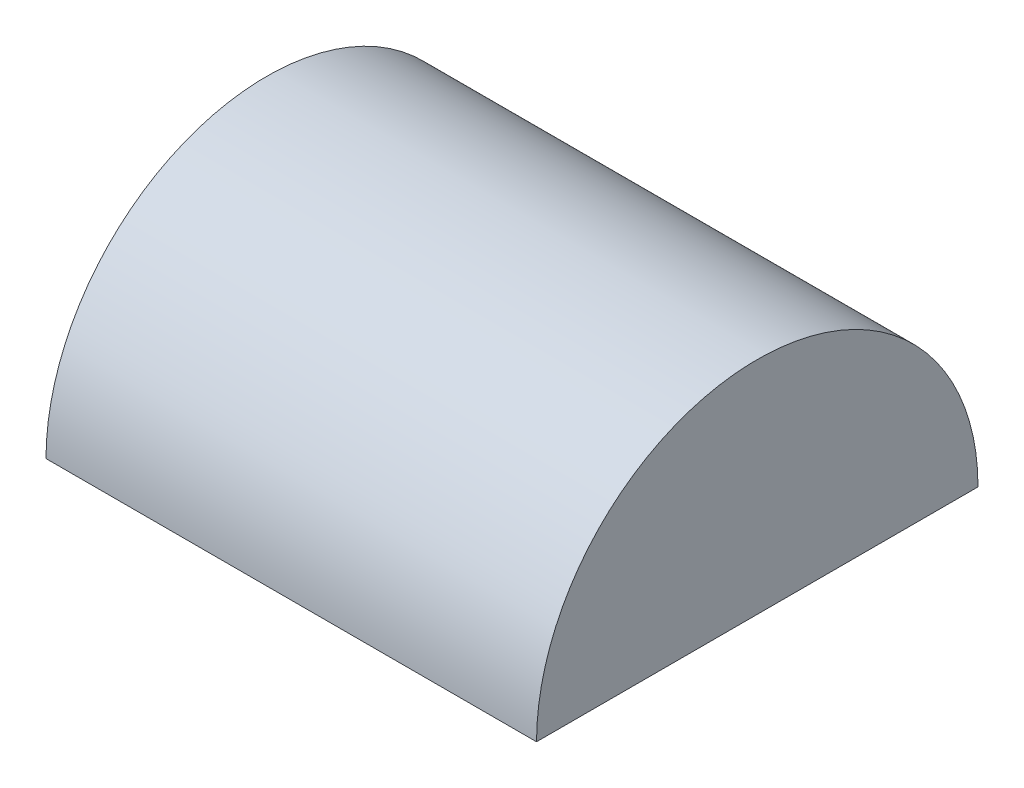
ISO-10303-21;
HEADER;
FILE_DESCRIPTION(('STEP AP214'),'2;1');
FILE_NAME('part.step','',(''),(''),'','','');
FILE_SCHEMA(('AUTOMOTIVE_DESIGN { 1 0 10303 214 1 1 1 1 }'));
ENDSEC;
DATA;
#1=APPLICATION_CONTEXT('core data for automotive mechanical design processes');
#2=APPLICATION_PROTOCOL_DEFINITION('international standard','automotive_design',2000,#1);
#3=PRODUCT_CONTEXT('',#1,'mechanical');
#4=PRODUCT('Part','Part','',(#3));
#5=PRODUCT_RELATED_PRODUCT_CATEGORY('part','',(#4));
#6=PRODUCT_DEFINITION_FORMATION('','',#4);
#7=PRODUCT_DEFINITION_CONTEXT('part definition',#1,'design');
#8=PRODUCT_DEFINITION('design','',#6,#7);
#9=PRODUCT_DEFINITION_SHAPE('','',#8);
#10=(LENGTH_UNIT() NAMED_UNIT(*) SI_UNIT(.MILLI.,.METRE.));
#11=(NAMED_UNIT(*) PLANE_ANGLE_UNIT() SI_UNIT($,.RADIAN.));
#12=(NAMED_UNIT(*) SI_UNIT($,.STERADIAN.) SOLID_ANGLE_UNIT());
#13=UNCERTAINTY_MEASURE_WITH_UNIT(LENGTH_MEASURE(1.E-05),#10,'distance_accuracy_value','');
#14=(GEOMETRIC_REPRESENTATION_CONTEXT(3) GLOBAL_UNCERTAINTY_ASSIGNED_CONTEXT((#13)) GLOBAL_UNIT_ASSIGNED_CONTEXT((#10,
#11,#12)) REPRESENTATION_CONTEXT('',''));
#15=CARTESIAN_POINT('',(0.,0.,0.));
#16=DIRECTION('',(0.,0.,1.));
#17=DIRECTION('',(1.,0.,0.));
#18=AXIS2_PLACEMENT_3D('',#15,#16,#17);
#19=CARTESIAN_POINT('',(80.,0.,0.));
#20=DIRECTION('',(-1.,0.,0.));
#21=DIRECTION('',(0.,0.,1.));
#22=AXIS2_PLACEMENT_3D('',#19,#20,#21);
#23=CYLINDRICAL_SURFACE('',#22,36.);
#24=CARTESIAN_POINT('',(0.,0.,0.));
#25=DIRECTION('',(1.,0.,0.));
#26=DIRECTION('',(0.,0.,-1.));
#27=AXIS2_PLACEMENT_3D('',#24,#25,#26);
#28=CIRCLE('',#27,36.);
#29=CARTESIAN_POINT('',(0.,0.,-36.));
#30=VERTEX_POINT('',#29);
#31=CARTESIAN_POINT('',(0.,0.,36.));
#32=VERTEX_POINT('',#31);
#33=EDGE_CURVE('E64',#30,#32,#28,.T.);
#34=ORIENTED_EDGE('',*,*,#33,.T.);
#35=DIRECTION('',(-1.,0.,0.));
#36=VECTOR('',#35,1.);
#37=CARTESIAN_POINT('',(80.,0.,36.));
#38=LINE('',#37,#36);
#39=CARTESIAN_POINT('',(80.,0.,36.));
#40=VERTEX_POINT('',#39);
#41=EDGE_CURVE('E11',#40,#32,#38,.T.);
#42=ORIENTED_EDGE('',*,*,#41,.F.);
#43=CARTESIAN_POINT('',(80.,0.,0.));
#44=DIRECTION('',(1.,0.,0.));
#45=DIRECTION('',(0.,0.,-1.));
#46=AXIS2_PLACEMENT_3D('',#43,#44,#45);
#47=CIRCLE('',#46,36.);
#48=CARTESIAN_POINT('',(80.,0.,-36.));
#49=VERTEX_POINT('',#48);
#50=EDGE_CURVE('E63',#49,#40,#47,.T.);
#51=ORIENTED_EDGE('',*,*,#50,.F.);
#52=DIRECTION('',(-1.,0.,0.));
#53=VECTOR('',#52,1.);
#54=CARTESIAN_POINT('',(80.,0.,-36.));
#55=LINE('',#54,#53);
#56=EDGE_CURVE('E41',#49,#30,#55,.T.);
#57=ORIENTED_EDGE('',*,*,#56,.T.);
#58=EDGE_LOOP('',(#34,#42,#51,#57));
#59=FACE_BOUND('',#58,.T.);
#60=ADVANCED_FACE('F33',(#59),#23,.T.);
#61=CARTESIAN_POINT('',(80.,0.,36.));
#62=DIRECTION('',(0.,1.,0.));
#63=DIRECTION('',(0.,0.,1.));
#64=AXIS2_PLACEMENT_3D('',#61,#62,#63);
#65=PLANE('',#64);
#66=DIRECTION('',(0.,0.,-1.));
#67=VECTOR('',#66,1.);
#68=CARTESIAN_POINT('',(0.,0.,36.));
#69=LINE('',#68,#67);
#70=EDGE_CURVE('E56',#32,#30,#69,.T.);
#71=ORIENTED_EDGE('',*,*,#70,.T.);
#72=ORIENTED_EDGE('',*,*,#56,.F.);
#73=DIRECTION('',(0.,0.,-1.));
#74=VECTOR('',#73,1.);
#75=CARTESIAN_POINT('',(80.,0.,36.));
#76=LINE('',#75,#74);
#77=EDGE_CURVE('E48',#40,#49,#76,.T.);
#78=ORIENTED_EDGE('',*,*,#77,.F.);
#79=ORIENTED_EDGE('',*,*,#41,.T.);
#80=EDGE_LOOP('',(#71,#72,#78,#79));
#81=FACE_BOUND('',#80,.T.);
#82=ADVANCED_FACE('F59',(#81),#65,.F.);
#83=CARTESIAN_POINT('',(80.,0.,0.));
#84=DIRECTION('',(1.,0.,0.));
#85=DIRECTION('',(0.,0.,-1.));
#86=AXIS2_PLACEMENT_3D('',#83,#84,#85);
#87=PLANE('',#86);
#88=ORIENTED_EDGE('',*,*,#50,.T.);
#89=ORIENTED_EDGE('',*,*,#77,.T.);
#90=EDGE_LOOP('',(#88,#89));
#91=FACE_BOUND('',#90,.T.);
#92=ADVANCED_FACE('F71',(#91),#87,.T.);
#93=CARTESIAN_POINT('',(0.,0.,0.));
#94=DIRECTION('',(1.,0.,0.));
#95=DIRECTION('',(0.,0.,-1.));
#96=AXIS2_PLACEMENT_3D('',#93,#94,#95);
#97=PLANE('',#96);
#98=ORIENTED_EDGE('',*,*,#33,.F.);
#99=ORIENTED_EDGE('',*,*,#70,.F.);
#100=EDGE_LOOP('',(#98,#99));
#101=FACE_BOUND('',#100,.T.);
#102=ADVANCED_FACE('F67',(#101),#97,.F.);
#103=CLOSED_SHELL('',(#60,#82,#92,#102));
#104=MANIFOLD_SOLID_BREP('B2',#103);
#105=ADVANCED_BREP_SHAPE_REPRESENTATION('',(#18,#104),#14);
#106=SHAPE_DEFINITION_REPRESENTATION(#9,#105);
ENDSEC;
END-ISO-10303-21;
